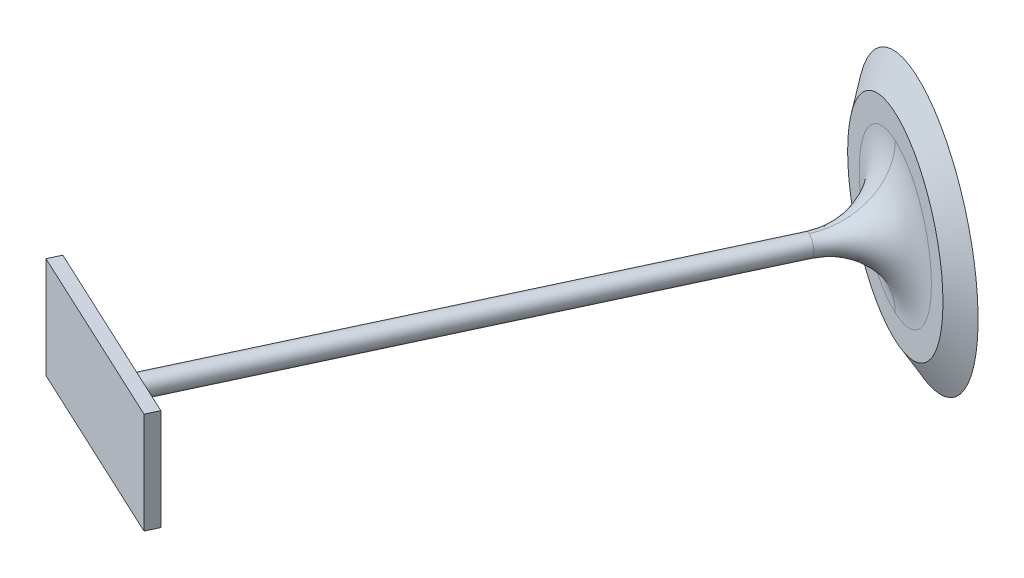
ISO-10303-21;
HEADER;
FILE_DESCRIPTION(('STEP AP214'),'2;1');
FILE_NAME('part.step','',(''),(''),'','','');
FILE_SCHEMA(('AUTOMOTIVE_DESIGN { 1 0 10303 214 1 1 1 1 }'));
ENDSEC;
DATA;
#1=APPLICATION_CONTEXT('core data for automotive mechanical design processes');
#2=APPLICATION_PROTOCOL_DEFINITION('international standard','automotive_design',2000,#1);
#3=PRODUCT_CONTEXT('',#1,'mechanical');
#4=PRODUCT('Part','Part','',(#3));
#5=PRODUCT_RELATED_PRODUCT_CATEGORY('part','',(#4));
#6=PRODUCT_DEFINITION_FORMATION('','',#4);
#7=PRODUCT_DEFINITION_CONTEXT('part definition',#1,'design');
#8=PRODUCT_DEFINITION('design','',#6,#7);
#9=PRODUCT_DEFINITION_SHAPE('','',#8);
#10=(LENGTH_UNIT() NAMED_UNIT(*) SI_UNIT(.MILLI.,.METRE.));
#11=(NAMED_UNIT(*) PLANE_ANGLE_UNIT() SI_UNIT($,.RADIAN.));
#12=(NAMED_UNIT(*) SI_UNIT($,.STERADIAN.) SOLID_ANGLE_UNIT());
#13=UNCERTAINTY_MEASURE_WITH_UNIT(LENGTH_MEASURE(1.E-05),#10,'distance_accuracy_value','');
#14=(GEOMETRIC_REPRESENTATION_CONTEXT(3) GLOBAL_UNCERTAINTY_ASSIGNED_CONTEXT((#13)) GLOBAL_UNIT_ASSIGNED_CONTEXT((#10,
#11,#12)) REPRESENTATION_CONTEXT('',''));
#15=CARTESIAN_POINT('',(0.,0.,0.));
#16=DIRECTION('',(0.,0.,1.));
#17=DIRECTION('',(1.,0.,0.));
#18=AXIS2_PLACEMENT_3D('',#15,#16,#17);
#19=CARTESIAN_POINT('',(-88.2990303866,69.8033504616,-4.474165169));
#20=DIRECTION('',(-0.422618261800258,0.,0.906307787008877));
#21=DIRECTION('',(0.906307787008877,0.,0.422618261800258));
#22=AXIS2_PLACEMENT_3D('',#19,#20,#21);
#23=PLANE('',#22);
#24=DIRECTION('',(0.906307787008877,0.,0.422618261800258));
#25=VECTOR('',#24,1.);
#26=CARTESIAN_POINT('',(-88.2990303866,79.8033504514,-4.474165169));
#27=LINE('',#26,#25);
#28=CARTESIAN_POINT('',(-70.17287464,79.8033504514,3.97820007));
#29=VERTEX_POINT('',#28);
#30=CARTESIAN_POINT('',(-88.2990303866,79.8033504514,-4.474165169));
#31=VERTEX_POINT('',#30);
#32=EDGE_CURVE('E66',#29,#31,#27,.F.);
#33=ORIENTED_EDGE('',*,*,#32,.T.);
#34=DIRECTION('',(0.,1.,0.));
#35=VECTOR('',#34,1.);
#36=CARTESIAN_POINT('',(-88.2990303866,74.8033504565,-4.474165169));
#37=LINE('',#36,#35);
#38=CARTESIAN_POINT('',(-88.2990303866,69.8033504616,-4.474165169));
#39=VERTEX_POINT('',#38);
#40=EDGE_CURVE('E62',#39,#31,#37,.T.);
#41=ORIENTED_EDGE('',*,*,#40,.F.);
#42=DIRECTION('',(0.906307787008877,0.,0.422618261800258));
#43=VECTOR('',#42,1.);
#44=CARTESIAN_POINT('',(-88.2990303866,69.8033504616,-4.474165169));
#45=LINE('',#44,#43);
#46=CARTESIAN_POINT('',(-70.17287464,69.8033504616,3.97820007));
#47=VERTEX_POINT('',#46);
#48=EDGE_CURVE('E21',#39,#47,#45,.T.);
#49=ORIENTED_EDGE('',*,*,#48,.T.);
#50=DIRECTION('',(0.,-1.,0.));
#51=VECTOR('',#50,1.);
#52=CARTESIAN_POINT('',(-70.17287464,74.8033504565,3.97820007));
#53=LINE('',#52,#51);
#54=EDGE_CURVE('E90',#29,#47,#53,.T.);
#55=ORIENTED_EDGE('',*,*,#54,.F.);
#56=EDGE_LOOP('',(#33,#41,#49,#55));
#57=FACE_BOUND('',#56,.T.);
#58=ADVANCED_FACE('F16',(#57),#23,.T.);
#59=CARTESIAN_POINT('',(-88.4109569598,69.8033504616,-5.664561442));
#60=DIRECTION('',(0.,1.,0.));
#61=DIRECTION('',(0.,0.,1.));
#62=AXIS2_PLACEMENT_3D('',#59,#60,#61);
#63=PLANE('',#62);
#64=DIRECTION('',(-0.906307786782047,0.,-0.422618262286697));
#65=VECTOR('',#64,1.);
#66=CARTESIAN_POINT('',(-78.7076796684,69.8033504616,-1.3808673043));
#67=LINE('',#66,#65);
#68=CARTESIAN_POINT('',(-69.6446018105141,69.8033504616,2.84531531191432));
#69=VERTEX_POINT('',#68);
#70=CARTESIAN_POINT('',(-87.7707575391208,69.8033504616,-5.60704992983834));
#71=VERTEX_POINT('',#70);
#72=EDGE_CURVE('E97',#69,#71,#67,.T.);
#73=ORIENTED_EDGE('',*,*,#72,.F.);
#74=DIRECTION('',(0.422618258606062,0.,-0.906307788498355));
#75=VECTOR('',#74,1.);
#76=CARTESIAN_POINT('',(-69.9087382239,69.8033504616,3.4117576926));
#77=LINE('',#76,#75);
#78=EDGE_CURVE('E78',#47,#69,#77,.T.);
#79=ORIENTED_EDGE('',*,*,#78,.F.);
#80=ORIENTED_EDGE('',*,*,#48,.F.);
#81=DIRECTION('',(-0.422618275296803,0.,0.906307780715335));
#82=VECTOR('',#81,1.);
#83=CARTESIAN_POINT('',(-88.0348939578,69.8033504616,-5.0406075464));
#84=LINE('',#83,#82);
#85=EDGE_CURVE('E70',#71,#39,#84,.T.);
#86=ORIENTED_EDGE('',*,*,#85,.F.);
#87=EDGE_LOOP('',(#73,#79,#80,#86));
#88=FACE_BOUND('',#87,.T.);
#89=ADVANCED_FACE('F75',(#88),#63,.F.);
#90=CARTESIAN_POINT('',(-87.770757529,69.8033504616,-5.6070499238));
#91=DIRECTION('',(-0.906307780715335,0.,-0.422618275296803));
#92=DIRECTION('',(-0.422618275296803,0.,0.906307780715335));
#93=AXIS2_PLACEMENT_3D('',#90,#91,#92);
#94=PLANE('',#93);
#95=DIRECTION('',(0.,1.,0.));
#96=VECTOR('',#95,1.);
#97=CARTESIAN_POINT('',(-87.770757529,74.8033504565,-5.6070499238));
#98=LINE('',#97,#96);
#99=CARTESIAN_POINT('',(-87.770757529,79.8033504514,-5.6070499238));
#100=VERTEX_POINT('',#99);
#101=EDGE_CURVE('E82',#71,#100,#98,.T.);
#102=ORIENTED_EDGE('',*,*,#101,.F.);
#103=ORIENTED_EDGE('',*,*,#85,.T.);
#104=ORIENTED_EDGE('',*,*,#40,.T.);
#105=DIRECTION('',(-0.422618275296803,0.,0.906307780715335));
#106=VECTOR('',#105,1.);
#107=CARTESIAN_POINT('',(-87.770757529,79.8033504514,-5.6070499238));
#108=LINE('',#107,#106);
#109=EDGE_CURVE('E85',#31,#100,#108,.F.);
#110=ORIENTED_EDGE('',*,*,#109,.T.);
#111=EDGE_LOOP('',(#102,#103,#104,#110));
#112=FACE_BOUND('',#111,.T.);
#113=ADVANCED_FACE('F80',(#112),#94,.T.);
#114=CARTESIAN_POINT('',(-88.4109569598,79.8033504514,4.0357115628));
#115=DIRECTION('',(0.,-1.,0.));
#116=DIRECTION('',(0.,0.,-1.));
#117=AXIS2_PLACEMENT_3D('',#114,#115,#116);
#118=PLANE('',#117);
#119=DIRECTION('',(0.906307786782047,0.,0.422618262286697));
#120=VECTOR('',#119,1.);
#121=CARTESIAN_POINT('',(-78.7076796684,79.8033504514,-1.3808673043));
#122=LINE('',#121,#120);
#123=CARTESIAN_POINT('',(-69.6446018132462,79.8033504514,2.84531530736555));
#124=VERTEX_POINT('',#123);
#125=EDGE_CURVE('E92',#100,#124,#122,.T.);
#126=ORIENTED_EDGE('',*,*,#125,.F.);
#127=ORIENTED_EDGE('',*,*,#109,.F.);
#128=ORIENTED_EDGE('',*,*,#32,.F.);
#129=DIRECTION('',(-0.422618258606062,0.,0.906307788498355));
#130=VECTOR('',#129,1.);
#131=CARTESIAN_POINT('',(-69.9087382239,79.8033504514,3.4117576926));
#132=LINE('',#131,#130);
#133=EDGE_CURVE('E89',#124,#29,#132,.T.);
#134=ORIENTED_EDGE('',*,*,#133,.F.);
#135=EDGE_LOOP('',(#126,#127,#128,#134));
#136=FACE_BOUND('',#135,.T.);
#137=ADVANCED_FACE('F150',(#136),#118,.F.);
#138=CARTESIAN_POINT('',(-70.17287464,69.8033504616,3.97820007));
#139=DIRECTION('',(0.906307788498355,0.,0.422618258606062));
#140=DIRECTION('',(0.422618258606062,0.,-0.906307788498355));
#141=AXIS2_PLACEMENT_3D('',#138,#139,#140);
#142=PLANE('',#141);
#143=DIRECTION('',(0.,-1.,0.));
#144=VECTOR('',#143,1.);
#145=CARTESIAN_POINT('',(-69.6446018078,74.8033504565,2.8453153152));
#146=LINE('',#145,#144);
#147=EDGE_CURVE('E95',#124,#69,#146,.T.);
#148=ORIENTED_EDGE('',*,*,#147,.F.);
#149=ORIENTED_EDGE('',*,*,#133,.T.);
#150=ORIENTED_EDGE('',*,*,#54,.T.);
#151=ORIENTED_EDGE('',*,*,#78,.T.);
#152=EDGE_LOOP('',(#148,#149,#150,#151));
#153=FACE_BOUND('',#152,.T.);
#154=ADVANCED_FACE('F286',(#153),#142,.T.);
#155=CARTESIAN_POINT('',(-41.9751361918,62.1558673314,-50.227566423));
#156=DIRECTION('',(0.42261826190662,0.,-0.90630778695928));
#157=DIRECTION('',(-0.90630778695928,0.,-0.42261826190662));
#158=AXIS2_PLACEMENT_3D('',#155,#156,#157);
#159=PLANE('',#158);
#160=CARTESIAN_POINT('',(-53.4376486191767,74.8033504438,-55.5726237636858));
#161=DIRECTION('',(0.422618261750092,0.,-0.90630778703227));
#162=DIRECTION('',(-0.90630778703227,0.,-0.422618261750092));
#163=AXIS2_PLACEMENT_3D('',#160,#161,#162);
#164=CIRCLE('',#163,12.4975129750485);
#165=CARTESIAN_POINT('',(-64.764241947,74.8033504438,-60.8543009734));
#166=VERTEX_POINT('',#165);
#167=EDGE_CURVE('E143',#166,#166,#164,.T.);
#168=ORIENTED_EDGE('',*,*,#167,.T.);
#169=EDGE_LOOP('',(#168));
#170=FACE_BOUND('',#169,.T.);
#171=ADVANCED_FACE('F277',(#170),#159,.T.);
#172=CARTESIAN_POINT('',(-69.6446018078,69.8033504616,2.8453153152));
#173=DIRECTION('',(0.422618262286697,0.,-0.906307786782047));
#174=DIRECTION('',(-0.906307786782047,0.,-0.422618262286697));
#175=AXIS2_PLACEMENT_3D('',#172,#173,#174);
#176=PLANE('',#175);
#177=CARTESIAN_POINT('',(-78.7076796768441,74.8033504438,-1.38086729889171));
#178=DIRECTION('',(0.422618261750104,0.,-0.906307787032265));
#179=DIRECTION('',(-0.906307787032265,0.,-0.422618261750104));
#180=AXIS2_PLACEMENT_3D('',#177,#178,#179);
#181=CIRCLE('',#180,0.960000007354454);
#182=CARTESIAN_POINT('',(-79.5777351590604,74.8033504438,-1.78658083327994));
#183=VERTEX_POINT('',#182);
#184=EDGE_CURVE('E140',#183,#183,#181,.F.);
#185=ORIENTED_EDGE('',*,*,#184,.T.);
#186=EDGE_LOOP('',(#185));
#187=FACE_BOUND('',#186,.T.);
#188=ORIENTED_EDGE('',*,*,#125,.T.);
#189=ORIENTED_EDGE('',*,*,#147,.T.);
#190=ORIENTED_EDGE('',*,*,#72,.T.);
#191=ORIENTED_EDGE('',*,*,#101,.T.);
#192=EDGE_LOOP('',(#188,#189,#190,#191));
#193=FACE_BOUND('',#192,.T.);
#194=ADVANCED_FACE('F154',(#187,#193),#176,.T.);
#195=CARTESIAN_POINT('',(-54.1138378436323,74.8033504438,-54.1225312923061));
#196=DIRECTION('',(0.422618261750092,0.,-0.90630778703227));
#197=DIRECTION('',(-0.90630778703227,0.,-0.422618261750092));
#198=AXIS2_PLACEMENT_3D('',#195,#196,#197);
#199=CONICAL_SURFACE('',#198,9.72623168452803,1.04719754732664);
#200=ORIENTED_EDGE('',*,*,#167,.F.);
#201=EDGE_LOOP('',(#200));
#202=FACE_BOUND('',#201,.T.);
#203=CARTESIAN_POINT('',(-54.1138378436323,74.8033504438,-54.1225312923061));
#204=DIRECTION('',(0.422618261750092,0.,-0.90630778703227));
#205=DIRECTION('',(-0.90630778703227,0.,-0.422618261750092));
#206=AXIS2_PLACEMENT_3D('',#203,#204,#205);
#207=CIRCLE('',#206,9.72623168452806);
#208=CARTESIAN_POINT('',(-62.9287973578001,74.8033504438,-58.2330144202));
#209=VERTEX_POINT('',#208);
#210=EDGE_CURVE('E132',#209,#209,#207,.F.);
#211=ORIENTED_EDGE('',*,*,#210,.F.);
#212=EDGE_LOOP('',(#211));
#213=FACE_BOUND('',#212,.T.);
#214=ADVANCED_FACE('F177',(#202,#213),#199,.T.);
#215=CARTESIAN_POINT('',(-78.7076796768441,74.8033504438,-1.38086729889171));
#216=DIRECTION('',(0.422618261750104,0.,-0.906307787032265));
#217=DIRECTION('',(-0.906307787032265,0.,-0.422618261750104));
#218=AXIS2_PLACEMENT_3D('',#215,#216,#217);
#219=CYLINDRICAL_SURFACE('',#218,0.960000007354454);
#220=ORIENTED_EDGE('',*,*,#184,.F.);
#221=EDGE_LOOP('',(#220));
#222=FACE_BOUND('',#221,.T.);
#223=CARTESIAN_POINT('',(-56.8185947187236,74.8033504438,-48.322161473932));
#224=DIRECTION('',(0.422618261750096,0.,-0.906307787032268));
#225=DIRECTION('',(-0.906307787032271,0.,-0.42261826175009));
#226=AXIS2_PLACEMENT_3D('',#223,#224,#225);
#227=CIRCLE('',#226,0.960000012275545);
#228=CARTESIAN_POINT('',(-56.8185947154396,75.763350457119,-48.3221614707236));
#229=VERTEX_POINT('',#228);
#230=CARTESIAN_POINT('',(-55.9485392354604,74.8033504466797,-47.916447935898));
#231=VERTEX_POINT('',#230);
#232=EDGE_CURVE('E146',#229,#231,#227,.T.);
#233=ORIENTED_EDGE('',*,*,#232,.F.);
#234=CARTESIAN_POINT('',(-56.8185947187236,74.8033504438,-48.322161473932));
#235=DIRECTION('',(0.422618261750096,0.,-0.906307787032268));
#236=DIRECTION('',(-0.906307787032271,0.,-0.42261826175009));
#237=AXIS2_PLACEMENT_3D('',#234,#235,#236);
#238=CIRCLE('',#237,0.960000012275545);
#239=CARTESIAN_POINT('',(-56.8185947152431,73.843350443181,-48.322161470632));
#240=VERTEX_POINT('',#239);
#241=EDGE_CURVE('E36',#240,#229,#238,.T.);
#242=ORIENTED_EDGE('',*,*,#241,.F.);
#243=CARTESIAN_POINT('',(-56.8185947192,74.8033504565,-48.3221614708));
#244=DIRECTION('',(0.422618269687064,0.,-0.906307783331199));
#245=DIRECTION('',(-0.9063077833312,0.,-0.422618269687064));
#246=AXIS2_PLACEMENT_3D('',#243,#244,#245);
#247=CIRCLE('',#246,0.959999997699995);
#248=EDGE_CURVE('E163',#231,#240,#247,.T.);
#249=ORIENTED_EDGE('',*,*,#248,.F.);
#250=EDGE_LOOP('',(#233,#242,#249));
#251=FACE_BOUND('',#250,.T.);
#252=ADVANCED_FACE('F175',(#222,#251),#219,.T.);
#253=CARTESIAN_POINT('',(-63.0345768516,64.9604040134,-58.2823402296));
#254=DIRECTION('',(-0.42261826234187,0.,0.906307786756319));
#255=DIRECTION('',(0.906307786756319,0.,0.42261826234187));
#256=AXIS2_PLACEMENT_3D('',#253,#254,#255);
#257=PLANE('',#256);
#258=CARTESIAN_POINT('',(-54.1138378478,67.4433504609713,-54.1225313026));
#259=CARTESIAN_POINT('',(-40.7729872186358,67.4433504609713,-47.9015904837876));
#260=CARTESIAN_POINT('',(-40.7729872186358,82.1633504520288,-47.9015904837876));
#261=CARTESIAN_POINT('',(-54.1138378478,82.1633504520288,-54.1225313026));
#262=(BOUNDED_CURVE() B_SPLINE_CURVE(3,(#258,#259,#260,#261),.UNSPECIFIED.,.F.,
.F.) B_SPLINE_CURVE_WITH_KNOTS((4,4),(0.,1.),
.UNSPECIFIED.) CURVE() GEOMETRIC_REPRESENTATION_ITEM() RATIONAL_B_SPLINE_CURVE((0.999999999755923,
0.33333333325197,0.33333333325197,0.999999999755923)) REPRESENTATION_ITEM(''));
#263=CARTESIAN_POINT('',(-47.443412528858,74.8033504565,-51.0120608924612));
#264=VERTEX_POINT('',#263);
#265=CARTESIAN_POINT('',(-54.1138378437583,82.1633504511367,-54.1225313039586));
#266=VERTEX_POINT('',#265);
#267=EDGE_CURVE('E105',#264,#266,#262,.T.);
#268=ORIENTED_EDGE('',*,*,#267,.F.);
#269=CARTESIAN_POINT('',(-54.1138378478,67.4433504609713,-54.1225313026));
#270=CARTESIAN_POINT('',(-40.7729872186358,67.4433504609712,-47.9015904837876));
#271=CARTESIAN_POINT('',(-40.7729872186358,82.1633504520288,-47.9015904837876));
#272=CARTESIAN_POINT('',(-54.1138378478,82.1633504520288,-54.1225313026));
#273=(BOUNDED_CURVE() B_SPLINE_CURVE(3,(#269,#270,#271,#272),.UNSPECIFIED.,.F.,
.F.) B_SPLINE_CURVE_WITH_KNOTS((4,4),(0.,1.),
.UNSPECIFIED.) CURVE() GEOMETRIC_REPRESENTATION_ITEM() RATIONAL_B_SPLINE_CURVE((0.999999999755923,
0.33333333325197,0.33333333325197,0.999999999755923)) REPRESENTATION_ITEM(''));
#274=CARTESIAN_POINT('',(-54.1138378437583,67.4433504618633,-54.1225313039586));
#275=VERTEX_POINT('',#274);
#276=EDGE_CURVE('E116',#275,#264,#273,.T.);
#277=ORIENTED_EDGE('',*,*,#276,.F.);
#278=CARTESIAN_POINT('',(-54.1138378478,82.1633504520028,-54.1225313026));
#279=CARTESIAN_POINT('',(-67.4546884769172,82.1633504520028,-60.3434721213905));
#280=CARTESIAN_POINT('',(-67.4546884769172,67.4433504609972,-60.3434721213905));
#281=CARTESIAN_POINT('',(-54.1138378478,67.4433504609972,-54.1225313026));
#282=(BOUNDED_CURVE() B_SPLINE_CURVE(3,(#278,#279,#280,#281),.UNSPECIFIED.,.F.,
.F.) B_SPLINE_CURVE_WITH_KNOTS((4,4),(0.,1.),
.UNSPECIFIED.) CURVE() GEOMETRIC_REPRESENTATION_ITEM() RATIONAL_B_SPLINE_CURVE((0.999999999754243,
0.333333333251412,0.333333333251412,0.999999999754243)) REPRESENTATION_ITEM(''));
#283=EDGE_CURVE('E128',#266,#275,#282,.T.);
#284=ORIENTED_EDGE('',*,*,#283,.F.);
#285=EDGE_LOOP('',(#268,#277,#284));
#286=FACE_BOUND('',#285,.T.);
#287=ORIENTED_EDGE('',*,*,#210,.T.);
#288=EDGE_LOOP('',(#287));
#289=FACE_BOUND('',#288,.T.);
#290=ADVANCED_FACE('F18',(#286,#289),#257,.T.);
#291=CARTESIAN_POINT('',(-54.1138378478,82.1633504558,-54.1225313026));
#292=CARTESIAN_POINT('',(-40.7729872118,82.1633504558,-47.9015904806));
#293=CARTESIAN_POINT('',(-40.7729872118,67.4433504572,-47.9015904806));
#294=CARTESIAN_POINT('',(-54.1138378478,67.4433504572,-54.1225313026));
#295=CARTESIAN_POINT('',(-54.1138378478,78.414317263,-54.1225313026));
#296=CARTESIAN_POINT('',(-47.5685431914,78.414317263,-51.0704102796));
#297=CARTESIAN_POINT('',(-47.5685431914,71.19238365,-51.0704102796));
#298=CARTESIAN_POINT('',(-54.1138378478,71.19238365,-54.1225313026));
#299=CARTESIAN_POINT('',(-55.2341848324,75.7633504542,-51.7199394606));
#300=CARTESIAN_POINT('',(-53.4940738854,75.7633504542,-50.9085123814));
#301=CARTESIAN_POINT('',(-53.4940738854,73.8433504588,-50.9085123814));
#302=CARTESIAN_POINT('',(-55.2341848324,73.8433504588,-51.7199394606));
#303=CARTESIAN_POINT('',(-56.8185947192,75.7633504542,-48.3221614708));
#304=CARTESIAN_POINT('',(-55.0784837722,75.7633504542,-47.5107343916));
#305=CARTESIAN_POINT('',(-55.0784837722,73.8433504588,-47.5107343916));
#306=CARTESIAN_POINT('',(-56.8185947192,73.8433504588,-48.3221614708));
#307=(BOUNDED_SURFACE() B_SPLINE_SURFACE(3,3,((#291,#292,#293,#294),(#295,#296,#297,#298),(#299,
#300,#301,#302),(#303,#304,#305,#306)),.UNSPECIFIED.,.F.,.F.,
.F.) B_SPLINE_SURFACE_WITH_KNOTS((4,4),(4,4),(0.,1.),(0.,1.),
.UNSPECIFIED.) GEOMETRIC_REPRESENTATION_ITEM() RATIONAL_B_SPLINE_SURFACE(((1.,0.333333333333329,
0.333333333333329,1.),(0.804737854124364,0.268245951374785,0.268245951374785,0.804737854124364),
(0.804737854124364,0.268245951374785,0.268245951374785,0.804737854124364),(1.,0.333333333333329,
0.333333333333329,1.))) REPRESENTATION_ITEM('') SURFACE());
#308=CARTESIAN_POINT('',(-56.8185947123341,67.4433504572,-48.3221614675984));
#309=DIRECTION('',(0.90630778811493,0.,0.422618259428321));
#310=DIRECTION('',(0.422618259428321,0.,-0.90630778811493));
#311=AXIS2_PLACEMENT_3D('',#308,#309,#310);
#312=CIRCLE('',#311,6.39999999763753);
#313=EDGE_CURVE('E27',#275,#240,#312,.T.);
#314=CARTESIAN_POINT('',(-56.8185947123341,82.1633504558,-48.3221614675984));
#315=DIRECTION('',(0.90630778811493,0.,0.422618259428321));
#316=DIRECTION('',(0.422618259428321,0.,-0.90630778811493));
#317=AXIS2_PLACEMENT_3D('',#314,#315,#316);
#318=CIRCLE('',#317,6.39999999763755);
#319=EDGE_CURVE('E10',#229,#266,#318,.T.);
#320=ORIENTED_EDGE('',*,*,#232,.T.);
#321=ORIENTED_EDGE('',*,*,#248,.T.);
#322=ORIENTED_EDGE('',*,*,#313,.F.);
#323=ORIENTED_EDGE('',*,*,#276,.T.);
#324=ORIENTED_EDGE('',*,*,#267,.T.);
#325=ORIENTED_EDGE('',*,*,#319,.F.);
#326=EDGE_LOOP('',(#320,#321,#322,#323,#324,#325));
#327=FACE_BOUND('',#326,.T.);
#328=ADVANCED_FACE('F172',(#327),#307,.T.);
#329=CARTESIAN_POINT('',(-54.1138378478,67.4433504572,-54.1225313026));
#330=CARTESIAN_POINT('',(-67.4546884838,67.4433504572,-60.3434721246));
#331=CARTESIAN_POINT('',(-67.4546884838,82.1633504558,-60.3434721246));
#332=CARTESIAN_POINT('',(-54.1138378478,82.1633504558,-54.1225313026));
#333=CARTESIAN_POINT('',(-54.1138378478,71.19238365,-54.1225313026));
#334=CARTESIAN_POINT('',(-60.6591325042,71.19238365,-57.1746523256));
#335=CARTESIAN_POINT('',(-60.6591325042,78.414317263,-57.1746523256));
#336=CARTESIAN_POINT('',(-54.1138378478,78.414317263,-54.1225313026));
#337=CARTESIAN_POINT('',(-55.2341848324,73.8433504588,-51.7199394606));
#338=CARTESIAN_POINT('',(-56.9742957794,73.8433504588,-52.5313665144));
#339=CARTESIAN_POINT('',(-56.9742957794,75.7633504542,-52.5313665144));
#340=CARTESIAN_POINT('',(-55.2341848324,75.7633504542,-51.7199394606));
#341=CARTESIAN_POINT('',(-56.8185947192,73.8433504588,-48.3221614708));
#342=CARTESIAN_POINT('',(-58.5587056662,73.8433504588,-49.1335885246));
#343=CARTESIAN_POINT('',(-58.5587056662,75.7633504542,-49.1335885246));
#344=CARTESIAN_POINT('',(-56.8185947192,75.7633504542,-48.3221614708));
#345=(BOUNDED_SURFACE() B_SPLINE_SURFACE(3,3,((#329,#330,#331,#332),(#333,#334,#335,#336),(#337,
#338,#339,#340),(#341,#342,#343,#344)),.UNSPECIFIED.,.F.,.F.,
.F.) B_SPLINE_SURFACE_WITH_KNOTS((4,4),(4,4),(0.,1.),(0.,1.),
.UNSPECIFIED.) GEOMETRIC_REPRESENTATION_ITEM() RATIONAL_B_SPLINE_SURFACE(((1.,0.333333333333331,
0.333333333333331,1.),(0.804737854124363,0.268245951374786,0.268245951374786,0.804737854124363),
(0.804737854124363,0.268245951374786,0.268245951374786,0.804737854124363),(1.,0.333333333333331,
0.333333333333331,1.))) REPRESENTATION_ITEM('') SURFACE());
#346=ORIENTED_EDGE('',*,*,#241,.T.);
#347=ORIENTED_EDGE('',*,*,#319,.T.);
#348=ORIENTED_EDGE('',*,*,#283,.T.);
#349=ORIENTED_EDGE('',*,*,#313,.T.);
#350=EDGE_LOOP('',(#346,#347,#348,#349));
#351=FACE_BOUND('',#350,.T.);
#352=ADVANCED_FACE('F189',(#351),#345,.T.);
#353=CLOSED_SHELL('',(#58,#89,#113,#137,#154,#171,#194,#214,#252,#290,#328,#352));
#354=MANIFOLD_SOLID_BREP('B1',#353);
#355=ADVANCED_BREP_SHAPE_REPRESENTATION('',(#18,#354),#14);
#356=SHAPE_DEFINITION_REPRESENTATION(#9,#355);
ENDSEC;
END-ISO-10303-21;
